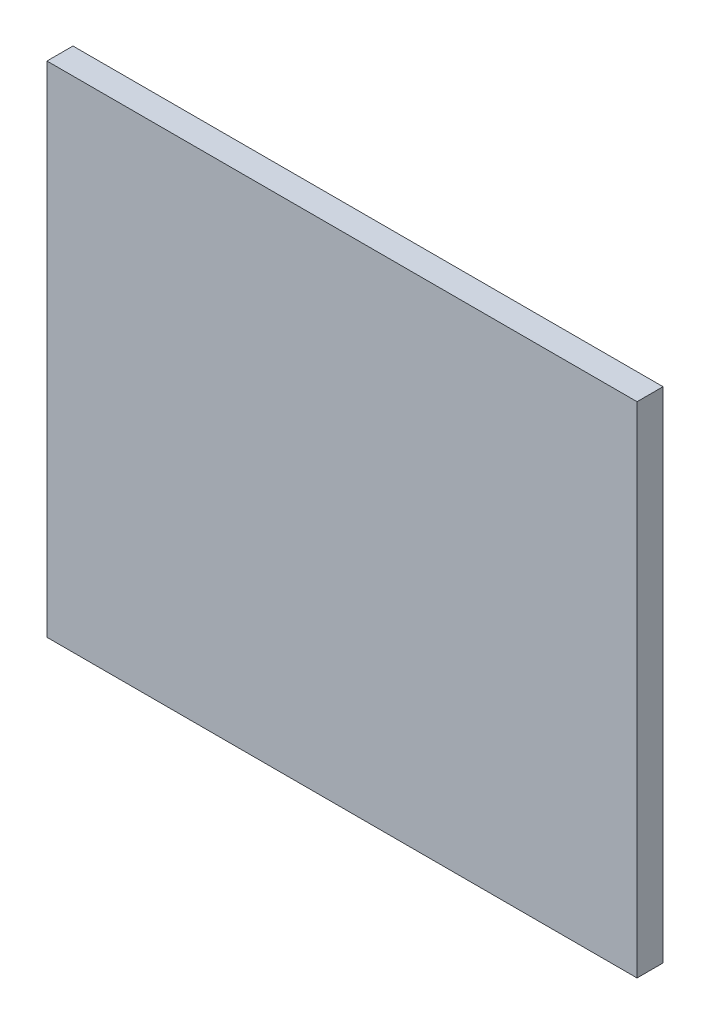
ISO-10303-21;
HEADER;
FILE_DESCRIPTION(('STEP AP214'),'2;1');
FILE_NAME('part.step','',(''),(''),'','','');
FILE_SCHEMA(('AUTOMOTIVE_DESIGN { 1 0 10303 214 1 1 1 1 }'));
ENDSEC;
DATA;
#1=APPLICATION_CONTEXT('core data for automotive mechanical design processes');
#2=APPLICATION_PROTOCOL_DEFINITION('international standard','automotive_design',2000,#1);
#3=PRODUCT_CONTEXT('',#1,'mechanical');
#4=PRODUCT('Part','Part','',(#3));
#5=PRODUCT_RELATED_PRODUCT_CATEGORY('part','',(#4));
#6=PRODUCT_DEFINITION_FORMATION('','',#4);
#7=PRODUCT_DEFINITION_CONTEXT('part definition',#1,'design');
#8=PRODUCT_DEFINITION('design','',#6,#7);
#9=PRODUCT_DEFINITION_SHAPE('','',#8);
#10=(LENGTH_UNIT() NAMED_UNIT(*) SI_UNIT(.MILLI.,.METRE.));
#11=(NAMED_UNIT(*) PLANE_ANGLE_UNIT() SI_UNIT($,.RADIAN.));
#12=(NAMED_UNIT(*) SI_UNIT($,.STERADIAN.) SOLID_ANGLE_UNIT());
#13=UNCERTAINTY_MEASURE_WITH_UNIT(LENGTH_MEASURE(1.E-05),#10,'distance_accuracy_value','');
#14=(GEOMETRIC_REPRESENTATION_CONTEXT(3) GLOBAL_UNCERTAINTY_ASSIGNED_CONTEXT((#13)) GLOBAL_UNIT_ASSIGNED_CONTEXT((#10,
#11,#12)) REPRESENTATION_CONTEXT('',''));
#15=CARTESIAN_POINT('',(0.,0.,0.));
#16=DIRECTION('',(0.,0.,1.));
#17=DIRECTION('',(1.,0.,0.));
#18=AXIS2_PLACEMENT_3D('',#15,#16,#17);
#19=CARTESIAN_POINT('',(-86.901707472395,-31.9269895154818,-10.));
#20=DIRECTION('',(-1.,0.,0.));
#21=DIRECTION('',(0.,0.,1.));
#22=AXIS2_PLACEMENT_3D('',#19,#20,#21);
#23=PLANE('',#22);
#24=DIRECTION('',(0.,-1.,0.));
#25=VECTOR('',#24,1.);
#26=CARTESIAN_POINT('',(-86.901707472395,-31.9269895154818,0.));
#27=LINE('',#26,#25);
#28=CARTESIAN_POINT('',(-86.901707472395,160.073010484518,0.));
#29=VERTEX_POINT('',#28);
#30=CARTESIAN_POINT('',(-86.901707472395,-31.9269895154818,0.));
#31=VERTEX_POINT('',#30);
#32=EDGE_CURVE('E95',#29,#31,#27,.T.);
#33=ORIENTED_EDGE('',*,*,#32,.F.);
#34=DIRECTION('',(0.,0.,1.));
#35=VECTOR('',#34,1.);
#36=CARTESIAN_POINT('',(-86.901707472395,160.073010484518,-10.));
#37=LINE('',#36,#35);
#38=CARTESIAN_POINT('',(-86.901707472395,160.073010484518,-10.));
#39=VERTEX_POINT('',#38);
#40=EDGE_CURVE('E11',#39,#29,#37,.T.);
#41=ORIENTED_EDGE('',*,*,#40,.F.);
#42=DIRECTION('',(0.,-1.,0.));
#43=VECTOR('',#42,1.);
#44=CARTESIAN_POINT('',(-86.901707472395,-31.9269895154818,-10.));
#45=LINE('',#44,#43);
#46=CARTESIAN_POINT('',(-86.901707472395,-31.9269895154818,-10.));
#47=VERTEX_POINT('',#46);
#48=EDGE_CURVE('E89',#39,#47,#45,.T.);
#49=ORIENTED_EDGE('',*,*,#48,.T.);
#50=DIRECTION('',(0.,0.,1.));
#51=VECTOR('',#50,1.);
#52=CARTESIAN_POINT('',(-86.901707472395,-31.9269895154818,-10.));
#53=LINE('',#52,#51);
#54=EDGE_CURVE('E34',#47,#31,#53,.T.);
#55=ORIENTED_EDGE('',*,*,#54,.T.);
#56=EDGE_LOOP('',(#33,#41,#49,#55));
#57=FACE_BOUND('',#56,.T.);
#58=ADVANCED_FACE('F31',(#57),#23,.T.);
#59=CARTESIAN_POINT('',(140.098292527605,160.073010484518,-10.));
#60=DIRECTION('',(0.,1.,0.));
#61=DIRECTION('',(-1.,0.,0.));
#62=AXIS2_PLACEMENT_3D('',#59,#60,#61);
#63=PLANE('',#62);
#64=DIRECTION('',(-1.,0.,0.));
#65=VECTOR('',#64,1.);
#66=CARTESIAN_POINT('',(140.098292527605,160.073010484518,0.));
#67=LINE('',#66,#65);
#68=CARTESIAN_POINT('',(140.098292527605,160.073010484518,0.));
#69=VERTEX_POINT('',#68);
#70=EDGE_CURVE('E91',#69,#29,#67,.T.);
#71=ORIENTED_EDGE('',*,*,#70,.F.);
#72=DIRECTION('',(0.,0.,1.));
#73=VECTOR('',#72,1.);
#74=CARTESIAN_POINT('',(140.098292527605,160.073010484518,-10.));
#75=LINE('',#74,#73);
#76=CARTESIAN_POINT('',(140.098292527605,160.073010484518,-10.));
#77=VERTEX_POINT('',#76);
#78=EDGE_CURVE('E40',#77,#69,#75,.T.);
#79=ORIENTED_EDGE('',*,*,#78,.F.);
#80=DIRECTION('',(-1.,0.,0.));
#81=VECTOR('',#80,1.);
#82=CARTESIAN_POINT('',(140.098292527605,160.073010484518,-10.));
#83=LINE('',#82,#81);
#84=EDGE_CURVE('E86',#77,#39,#83,.T.);
#85=ORIENTED_EDGE('',*,*,#84,.T.);
#86=ORIENTED_EDGE('',*,*,#40,.T.);
#87=EDGE_LOOP('',(#71,#79,#85,#86));
#88=FACE_BOUND('',#87,.T.);
#89=ADVANCED_FACE('F105',(#88),#63,.T.);
#90=CARTESIAN_POINT('',(140.098292527605,-31.9269895154818,-10.));
#91=DIRECTION('',(1.,0.,0.));
#92=DIRECTION('',(0.,0.,-1.));
#93=AXIS2_PLACEMENT_3D('',#90,#91,#92);
#94=PLANE('',#93);
#95=DIRECTION('',(0.,1.,0.));
#96=VECTOR('',#95,1.);
#97=CARTESIAN_POINT('',(140.098292527605,-31.9269895154818,0.));
#98=LINE('',#97,#96);
#99=CARTESIAN_POINT('',(140.098292527605,-31.9269895154818,0.));
#100=VERTEX_POINT('',#99);
#101=EDGE_CURVE('E81',#100,#69,#98,.T.);
#102=ORIENTED_EDGE('',*,*,#101,.F.);
#103=DIRECTION('',(0.,0.,1.));
#104=VECTOR('',#103,1.);
#105=CARTESIAN_POINT('',(140.098292527605,-31.9269895154818,-10.));
#106=LINE('',#105,#104);
#107=CARTESIAN_POINT('',(140.098292527605,-31.9269895154818,-10.));
#108=VERTEX_POINT('',#107);
#109=EDGE_CURVE('E76',#108,#100,#106,.T.);
#110=ORIENTED_EDGE('',*,*,#109,.F.);
#111=DIRECTION('',(0.,1.,0.));
#112=VECTOR('',#111,1.);
#113=CARTESIAN_POINT('',(140.098292527605,-31.9269895154818,-10.));
#114=LINE('',#113,#112);
#115=EDGE_CURVE('E79',#108,#77,#114,.T.);
#116=ORIENTED_EDGE('',*,*,#115,.T.);
#117=ORIENTED_EDGE('',*,*,#78,.T.);
#118=EDGE_LOOP('',(#102,#110,#116,#117));
#119=FACE_BOUND('',#118,.T.);
#120=ADVANCED_FACE('F78',(#119),#94,.T.);
#121=CARTESIAN_POINT('',(140.098292527605,-31.9269895154818,-10.));
#122=DIRECTION('',(0.,-1.,0.));
#123=DIRECTION('',(1.,0.,0.));
#124=AXIS2_PLACEMENT_3D('',#121,#122,#123);
#125=PLANE('',#124);
#126=DIRECTION('',(1.,0.,0.));
#127=VECTOR('',#126,1.);
#128=CARTESIAN_POINT('',(140.098292527605,-31.9269895154818,0.));
#129=LINE('',#128,#127);
#130=EDGE_CURVE('E98',#31,#100,#129,.T.);
#131=ORIENTED_EDGE('',*,*,#130,.F.);
#132=ORIENTED_EDGE('',*,*,#54,.F.);
#133=DIRECTION('',(1.,0.,0.));
#134=VECTOR('',#133,1.);
#135=CARTESIAN_POINT('',(140.098292527605,-31.9269895154818,-10.));
#136=LINE('',#135,#134);
#137=EDGE_CURVE('E85',#47,#108,#136,.T.);
#138=ORIENTED_EDGE('',*,*,#137,.T.);
#139=ORIENTED_EDGE('',*,*,#109,.T.);
#140=EDGE_LOOP('',(#131,#132,#138,#139));
#141=FACE_BOUND('',#140,.T.);
#142=ADVANCED_FACE('F88',(#141),#125,.T.);
#143=CARTESIAN_POINT('',(-86.901707472395,160.073010484518,-10.));
#144=DIRECTION('',(0.,0.,1.));
#145=DIRECTION('',(1.,0.,0.));
#146=AXIS2_PLACEMENT_3D('',#143,#144,#145);
#147=PLANE('',#146);
#148=ORIENTED_EDGE('',*,*,#48,.F.);
#149=ORIENTED_EDGE('',*,*,#84,.F.);
#150=ORIENTED_EDGE('',*,*,#115,.F.);
#151=ORIENTED_EDGE('',*,*,#137,.F.);
#152=EDGE_LOOP('',(#148,#149,#150,#151));
#153=FACE_BOUND('',#152,.T.);
#154=ADVANCED_FACE('F84',(#153),#147,.F.);
#155=CARTESIAN_POINT('',(-86.901707472395,160.073010484518,0.));
#156=DIRECTION('',(0.,0.,1.));
#157=DIRECTION('',(1.,0.,0.));
#158=AXIS2_PLACEMENT_3D('',#155,#156,#157);
#159=PLANE('',#158);
#160=ORIENTED_EDGE('',*,*,#32,.T.);
#161=ORIENTED_EDGE('',*,*,#130,.T.);
#162=ORIENTED_EDGE('',*,*,#101,.T.);
#163=ORIENTED_EDGE('',*,*,#70,.T.);
#164=EDGE_LOOP('',(#160,#161,#162,#163));
#165=FACE_BOUND('',#164,.T.);
#166=ADVANCED_FACE('F104',(#165),#159,.T.);
#167=CLOSED_SHELL('',(#58,#89,#120,#142,#154,#166));
#168=MANIFOLD_SOLID_BREP('B2',#167);
#169=ADVANCED_BREP_SHAPE_REPRESENTATION('',(#18,#168),#14);
#170=SHAPE_DEFINITION_REPRESENTATION(#9,#169);
ENDSEC;
END-ISO-10303-21;
